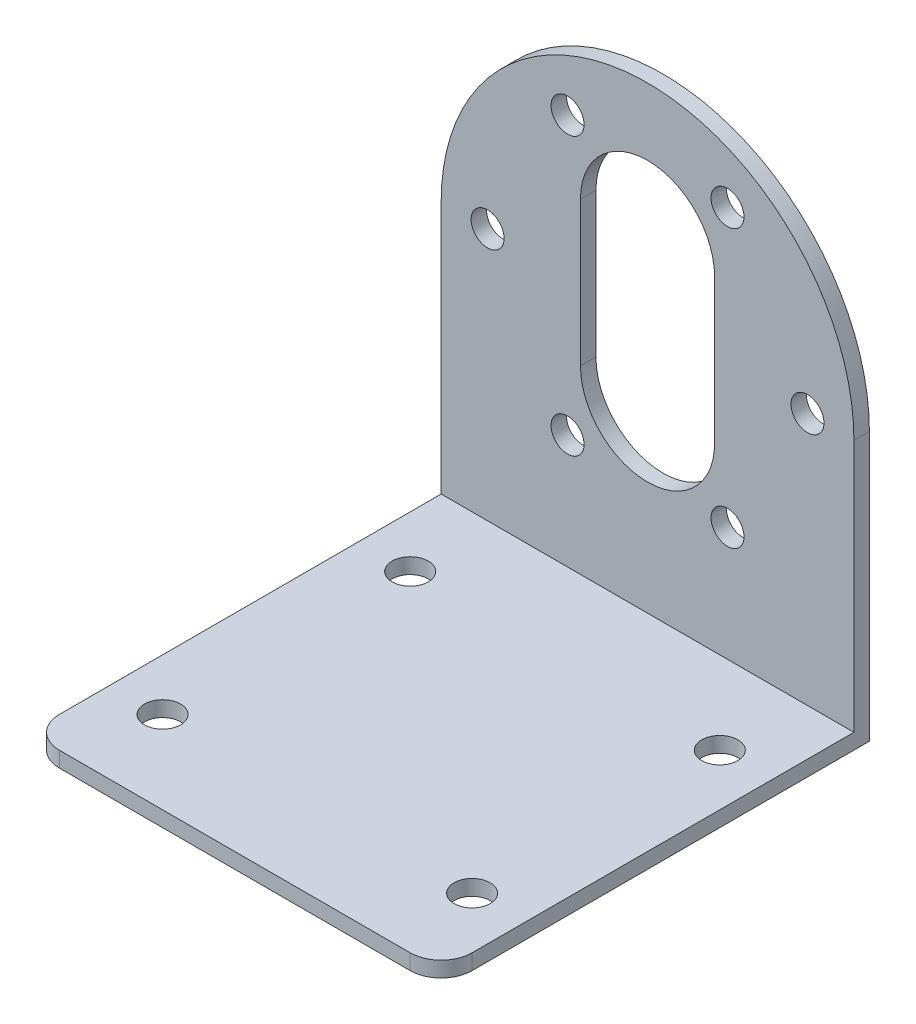
ISO-10303-21;
HEADER;
FILE_DESCRIPTION(('STEP AP214'),'2;1');
FILE_NAME('part.step','',(''),(''),'','','');
FILE_SCHEMA(('AUTOMOTIVE_DESIGN { 1 0 10303 214 1 1 1 1 }'));
ENDSEC;
DATA;
#1=APPLICATION_CONTEXT('core data for automotive mechanical design processes');
#2=APPLICATION_PROTOCOL_DEFINITION('international standard','automotive_design',2000,#1);
#3=PRODUCT_CONTEXT('',#1,'mechanical');
#4=PRODUCT('Part','Part','',(#3));
#5=PRODUCT_RELATED_PRODUCT_CATEGORY('part','',(#4));
#6=PRODUCT_DEFINITION_FORMATION('','',#4);
#7=PRODUCT_DEFINITION_CONTEXT('part definition',#1,'design');
#8=PRODUCT_DEFINITION('design','',#6,#7);
#9=PRODUCT_DEFINITION_SHAPE('','',#8);
#10=(LENGTH_UNIT() NAMED_UNIT(*) SI_UNIT(.MILLI.,.METRE.));
#11=(NAMED_UNIT(*) PLANE_ANGLE_UNIT() SI_UNIT($,.RADIAN.));
#12=(NAMED_UNIT(*) SI_UNIT($,.STERADIAN.) SOLID_ANGLE_UNIT());
#13=UNCERTAINTY_MEASURE_WITH_UNIT(LENGTH_MEASURE(1.E-05),#10,'distance_accuracy_value','');
#14=(GEOMETRIC_REPRESENTATION_CONTEXT(3) GLOBAL_UNCERTAINTY_ASSIGNED_CONTEXT((#13)) GLOBAL_UNIT_ASSIGNED_CONTEXT((#10,
#11,#12)) REPRESENTATION_CONTEXT('',''));
#15=CARTESIAN_POINT('',(0.,0.,0.));
#16=DIRECTION('',(0.,0.,1.));
#17=DIRECTION('',(1.,0.,0.));
#18=AXIS2_PLACEMENT_3D('',#15,#16,#17);
#19=CARTESIAN_POINT('',(-17.,1.5,37.));
#20=DIRECTION('',(0.,-1.,0.));
#21=DIRECTION('',(0.,0.,-1.));
#22=AXIS2_PLACEMENT_3D('',#19,#20,#21);
#23=PLANE('',#22);
#24=DIRECTION('',(0.,0.,1.));
#25=VECTOR('',#24,1.);
#26=CARTESIAN_POINT('',(-20.,1.5,0.));
#27=LINE('',#26,#25);
#28=CARTESIAN_POINT('',(-20.,1.5,0.));
#29=VERTEX_POINT('',#28);
#30=CARTESIAN_POINT('',(-20.,1.5,37.));
#31=VERTEX_POINT('',#30);
#32=EDGE_CURVE('E297',#29,#31,#27,.T.);
#33=ORIENTED_EDGE('',*,*,#32,.T.);
#34=CARTESIAN_POINT('',(-17.,1.5,37.));
#35=DIRECTION('',(0.,1.,0.));
#36=DIRECTION('',(0.,0.,-1.));
#37=AXIS2_PLACEMENT_3D('',#34,#35,#36);
#38=CIRCLE('',#37,3.);
#39=CARTESIAN_POINT('',(-17.,1.5,40.));
#40=VERTEX_POINT('',#39);
#41=EDGE_CURVE('E259',#31,#40,#38,.T.);
#42=ORIENTED_EDGE('',*,*,#41,.T.);
#43=DIRECTION('',(1.,0.,0.));
#44=VECTOR('',#43,1.);
#45=CARTESIAN_POINT('',(-17.,1.5,40.));
#46=LINE('',#45,#44);
#47=CARTESIAN_POINT('',(17.,1.5,40.));
#48=VERTEX_POINT('',#47);
#49=EDGE_CURVE('E267',#40,#48,#46,.T.);
#50=ORIENTED_EDGE('',*,*,#49,.T.);
#51=CARTESIAN_POINT('',(17.,1.5,37.));
#52=DIRECTION('',(0.,1.,0.));
#53=DIRECTION('',(0.,0.,1.));
#54=AXIS2_PLACEMENT_3D('',#51,#52,#53);
#55=CIRCLE('',#54,3.);
#56=CARTESIAN_POINT('',(20.,1.5,37.));
#57=VERTEX_POINT('',#56);
#58=EDGE_CURVE('E271',#48,#57,#55,.T.);
#59=ORIENTED_EDGE('',*,*,#58,.T.);
#60=DIRECTION('',(0.,0.,-1.));
#61=VECTOR('',#60,1.);
#62=CARTESIAN_POINT('',(20.,1.5,0.));
#63=LINE('',#62,#61);
#64=CARTESIAN_POINT('',(20.,1.5,0.));
#65=VERTEX_POINT('',#64);
#66=EDGE_CURVE('E279',#57,#65,#63,.T.);
#67=ORIENTED_EDGE('',*,*,#66,.T.);
#68=DIRECTION('',(-1.,0.,0.));
#69=VECTOR('',#68,1.);
#70=CARTESIAN_POINT('',(-20.,1.5,0.));
#71=LINE('',#70,#69);
#72=EDGE_CURVE('E281',#65,#29,#71,.T.);
#73=ORIENTED_EDGE('',*,*,#72,.T.);
#74=EDGE_LOOP('',(#33,#42,#50,#59,#67,#73));
#75=FACE_BOUND('',#74,.T.);
#76=CARTESIAN_POINT('',(-15.,1.5,7.99999999999999));
#77=DIRECTION('',(0.,1.,0.));
#78=DIRECTION('',(0.,0.,1.));
#79=AXIS2_PLACEMENT_3D('',#76,#77,#78);
#80=CIRCLE('',#79,1.75);
#81=CARTESIAN_POINT('',(-15.,1.5,9.74999999999999));
#82=VERTEX_POINT('',#81);
#83=EDGE_CURVE('E290',#82,#82,#80,.T.);
#84=ORIENTED_EDGE('',*,*,#83,.F.);
#85=EDGE_LOOP('',(#84));
#86=FACE_BOUND('',#85,.T.);
#87=CARTESIAN_POINT('',(15.,1.5,7.99999999999999));
#88=DIRECTION('',(0.,1.,0.));
#89=DIRECTION('',(0.,0.,1.));
#90=AXIS2_PLACEMENT_3D('',#87,#88,#89);
#91=CIRCLE('',#90,1.75);
#92=CARTESIAN_POINT('',(15.,1.5,9.74999999999999));
#93=VERTEX_POINT('',#92);
#94=EDGE_CURVE('E371',#93,#93,#91,.T.);
#95=ORIENTED_EDGE('',*,*,#94,.F.);
#96=EDGE_LOOP('',(#95));
#97=FACE_BOUND('',#96,.T.);
#98=CARTESIAN_POINT('',(-15.,1.5,32.));
#99=DIRECTION('',(0.,1.,0.));
#100=DIRECTION('',(0.,0.,1.));
#101=AXIS2_PLACEMENT_3D('',#98,#99,#100);
#102=CIRCLE('',#101,1.75);
#103=CARTESIAN_POINT('',(-15.,1.5,33.75));
#104=VERTEX_POINT('',#103);
#105=EDGE_CURVE('E365',#104,#104,#102,.T.);
#106=ORIENTED_EDGE('',*,*,#105,.F.);
#107=EDGE_LOOP('',(#106));
#108=FACE_BOUND('',#107,.T.);
#109=CARTESIAN_POINT('',(15.,1.5,32.));
#110=DIRECTION('',(0.,1.,0.));
#111=DIRECTION('',(0.,0.,1.));
#112=AXIS2_PLACEMENT_3D('',#109,#110,#111);
#113=CIRCLE('',#112,1.75);
#114=CARTESIAN_POINT('',(15.,1.5,33.75));
#115=VERTEX_POINT('',#114);
#116=EDGE_CURVE('E359',#115,#115,#113,.T.);
#117=ORIENTED_EDGE('',*,*,#116,.F.);
#118=EDGE_LOOP('',(#117));
#119=FACE_BOUND('',#118,.T.);
#120=ADVANCED_FACE('F208',(#75,#86,#97,#108,#119),#23,.F.);
#121=CARTESIAN_POINT('',(-17.,0.,37.));
#122=DIRECTION('',(0.,-1.,0.));
#123=DIRECTION('',(0.,0.,-1.));
#124=AXIS2_PLACEMENT_3D('',#121,#122,#123);
#125=PLANE('',#124);
#126=CARTESIAN_POINT('',(-15.,0.,32.));
#127=DIRECTION('',(0.,1.,0.));
#128=DIRECTION('',(0.,0.,1.));
#129=AXIS2_PLACEMENT_3D('',#126,#127,#128);
#130=CIRCLE('',#129,1.75);
#131=CARTESIAN_POINT('',(-15.,0.,33.75));
#132=VERTEX_POINT('',#131);
#133=EDGE_CURVE('E362',#132,#132,#130,.T.);
#134=ORIENTED_EDGE('',*,*,#133,.T.);
#135=EDGE_LOOP('',(#134));
#136=FACE_BOUND('',#135,.T.);
#137=CARTESIAN_POINT('',(-15.,0.,7.99999999999999));
#138=DIRECTION('',(0.,1.,0.));
#139=DIRECTION('',(0.,0.,1.));
#140=AXIS2_PLACEMENT_3D('',#137,#138,#139);
#141=CIRCLE('',#140,1.75);
#142=CARTESIAN_POINT('',(-15.,0.,9.74999999999999));
#143=VERTEX_POINT('',#142);
#144=EDGE_CURVE('E374',#143,#143,#141,.T.);
#145=ORIENTED_EDGE('',*,*,#144,.T.);
#146=EDGE_LOOP('',(#145));
#147=FACE_BOUND('',#146,.T.);
#148=DIRECTION('',(0.,0.,1.));
#149=VECTOR('',#148,1.);
#150=CARTESIAN_POINT('',(-20.,0.,0.));
#151=LINE('',#150,#149);
#152=CARTESIAN_POINT('',(-20.,0.,-1.5));
#153=VERTEX_POINT('',#152);
#154=CARTESIAN_POINT('',(-20.,0.,37.));
#155=VERTEX_POINT('',#154);
#156=EDGE_CURVE('E286',#153,#155,#151,.T.);
#157=ORIENTED_EDGE('',*,*,#156,.F.);
#158=DIRECTION('',(-1.,0.,0.));
#159=VECTOR('',#158,1.);
#160=CARTESIAN_POINT('',(20.,0.,-1.5));
#161=LINE('',#160,#159);
#162=CARTESIAN_POINT('',(20.,0.,-1.5));
#163=VERTEX_POINT('',#162);
#164=EDGE_CURVE('E306',#163,#153,#161,.T.);
#165=ORIENTED_EDGE('',*,*,#164,.F.);
#166=DIRECTION('',(0.,0.,-1.));
#167=VECTOR('',#166,1.);
#168=CARTESIAN_POINT('',(20.,0.,0.));
#169=LINE('',#168,#167);
#170=CARTESIAN_POINT('',(20.,0.,37.));
#171=VERTEX_POINT('',#170);
#172=EDGE_CURVE('E294',#171,#163,#169,.T.);
#173=ORIENTED_EDGE('',*,*,#172,.F.);
#174=CARTESIAN_POINT('',(17.,0.,37.));
#175=DIRECTION('',(0.,1.,0.));
#176=DIRECTION('',(0.,0.,1.));
#177=AXIS2_PLACEMENT_3D('',#174,#175,#176);
#178=CIRCLE('',#177,3.);
#179=CARTESIAN_POINT('',(17.,0.,40.));
#180=VERTEX_POINT('',#179);
#181=EDGE_CURVE('E251',#180,#171,#178,.T.);
#182=ORIENTED_EDGE('',*,*,#181,.F.);
#183=DIRECTION('',(1.,0.,0.));
#184=VECTOR('',#183,1.);
#185=CARTESIAN_POINT('',(-17.,0.,40.));
#186=LINE('',#185,#184);
#187=CARTESIAN_POINT('',(-17.,0.,40.));
#188=VERTEX_POINT('',#187);
#189=EDGE_CURVE('E244',#188,#180,#186,.T.);
#190=ORIENTED_EDGE('',*,*,#189,.F.);
#191=CARTESIAN_POINT('',(-17.,0.,37.));
#192=DIRECTION('',(0.,1.,0.));
#193=DIRECTION('',(0.,0.,-1.));
#194=AXIS2_PLACEMENT_3D('',#191,#192,#193);
#195=CIRCLE('',#194,3.);
#196=EDGE_CURVE('E289',#155,#188,#195,.T.);
#197=ORIENTED_EDGE('',*,*,#196,.F.);
#198=EDGE_LOOP('',(#157,#165,#173,#182,#190,#197));
#199=FACE_BOUND('',#198,.T.);
#200=CARTESIAN_POINT('',(15.,0.,7.99999999999999));
#201=DIRECTION('',(0.,1.,0.));
#202=DIRECTION('',(0.,0.,1.));
#203=AXIS2_PLACEMENT_3D('',#200,#201,#202);
#204=CIRCLE('',#203,1.75);
#205=CARTESIAN_POINT('',(15.,0.,9.74999999999999));
#206=VERTEX_POINT('',#205);
#207=EDGE_CURVE('E368',#206,#206,#204,.T.);
#208=ORIENTED_EDGE('',*,*,#207,.T.);
#209=EDGE_LOOP('',(#208));
#210=FACE_BOUND('',#209,.T.);
#211=CARTESIAN_POINT('',(15.,0.,32.));
#212=DIRECTION('',(0.,1.,0.));
#213=DIRECTION('',(0.,0.,1.));
#214=AXIS2_PLACEMENT_3D('',#211,#212,#213);
#215=CIRCLE('',#214,1.75);
#216=CARTESIAN_POINT('',(15.,0.,33.75));
#217=VERTEX_POINT('',#216);
#218=EDGE_CURVE('E357',#217,#217,#215,.T.);
#219=ORIENTED_EDGE('',*,*,#218,.T.);
#220=EDGE_LOOP('',(#219));
#221=FACE_BOUND('',#220,.T.);
#222=ADVANCED_FACE('F300',(#136,#147,#199,#210,#221),#125,.T.);
#223=CARTESIAN_POINT('',(-20.,1.5,0.));
#224=DIRECTION('',(1.,0.,0.));
#225=DIRECTION('',(0.,0.,-1.));
#226=AXIS2_PLACEMENT_3D('',#223,#224,#225);
#227=PLANE('',#226);
#228=ORIENTED_EDGE('',*,*,#156,.T.);
#229=DIRECTION('',(0.,-1.,0.));
#230=VECTOR('',#229,1.);
#231=CARTESIAN_POINT('',(-20.,1.5,37.));
#232=LINE('',#231,#230);
#233=EDGE_CURVE('E12',#31,#155,#232,.T.);
#234=ORIENTED_EDGE('',*,*,#233,.F.);
#235=ORIENTED_EDGE('',*,*,#32,.F.);
#236=DIRECTION('',(0.,1.,0.));
#237=VECTOR('',#236,1.);
#238=CARTESIAN_POINT('',(-20.,0.,0.));
#239=LINE('',#238,#237);
#240=CARTESIAN_POINT('',(-20.,26.,0.));
#241=VERTEX_POINT('',#240);
#242=EDGE_CURVE('E225',#29,#241,#239,.T.);
#243=ORIENTED_EDGE('',*,*,#242,.T.);
#244=DIRECTION('',(0.,0.,1.));
#245=VECTOR('',#244,1.);
#246=CARTESIAN_POINT('',(-20.,26.,-1.5));
#247=LINE('',#246,#245);
#248=CARTESIAN_POINT('',(-20.,26.,-1.5));
#249=VERTEX_POINT('',#248);
#250=EDGE_CURVE('E354',#249,#241,#247,.T.);
#251=ORIENTED_EDGE('',*,*,#250,.F.);
#252=DIRECTION('',(0.,1.,0.));
#253=VECTOR('',#252,1.);
#254=CARTESIAN_POINT('',(-20.,0.,-1.5));
#255=LINE('',#254,#253);
#256=EDGE_CURVE('E689',#153,#249,#255,.T.);
#257=ORIENTED_EDGE('',*,*,#256,.F.);
#258=EDGE_LOOP('',(#228,#234,#235,#243,#251,#257));
#259=FACE_BOUND('',#258,.T.);
#260=ADVANCED_FACE('F210',(#259),#227,.F.);
#261=CARTESIAN_POINT('',(-17.,1.5,37.));
#262=DIRECTION('',(0.,-1.,0.));
#263=DIRECTION('',(0.,0.,-1.));
#264=AXIS2_PLACEMENT_3D('',#261,#262,#263);
#265=CYLINDRICAL_SURFACE('',#264,3.);
#266=ORIENTED_EDGE('',*,*,#196,.T.);
#267=DIRECTION('',(0.,-1.,0.));
#268=VECTOR('',#267,1.);
#269=CARTESIAN_POINT('',(-17.,1.5,40.));
#270=LINE('',#269,#268);
#271=EDGE_CURVE('E217',#40,#188,#270,.T.);
#272=ORIENTED_EDGE('',*,*,#271,.F.);
#273=ORIENTED_EDGE('',*,*,#41,.F.);
#274=ORIENTED_EDGE('',*,*,#233,.T.);
#275=EDGE_LOOP('',(#266,#272,#273,#274));
#276=FACE_BOUND('',#275,.T.);
#277=ADVANCED_FACE('F384',(#276),#265,.T.);
#278=CARTESIAN_POINT('',(-17.,1.5,40.));
#279=DIRECTION('',(0.,0.,-1.));
#280=DIRECTION('',(-1.,0.,0.));
#281=AXIS2_PLACEMENT_3D('',#278,#279,#280);
#282=PLANE('',#281);
#283=ORIENTED_EDGE('',*,*,#189,.T.);
#284=DIRECTION('',(0.,-1.,0.));
#285=VECTOR('',#284,1.);
#286=CARTESIAN_POINT('',(17.,1.5,40.));
#287=LINE('',#286,#285);
#288=EDGE_CURVE('E273',#48,#180,#287,.T.);
#289=ORIENTED_EDGE('',*,*,#288,.F.);
#290=ORIENTED_EDGE('',*,*,#49,.F.);
#291=ORIENTED_EDGE('',*,*,#271,.T.);
#292=EDGE_LOOP('',(#283,#289,#290,#291));
#293=FACE_BOUND('',#292,.T.);
#294=ADVANCED_FACE('F274',(#293),#282,.F.);
#295=CARTESIAN_POINT('',(17.,1.5,37.));
#296=DIRECTION('',(0.,-1.,0.));
#297=DIRECTION('',(0.,0.,-1.));
#298=AXIS2_PLACEMENT_3D('',#295,#296,#297);
#299=CYLINDRICAL_SURFACE('',#298,3.);
#300=ORIENTED_EDGE('',*,*,#181,.T.);
#301=DIRECTION('',(0.,-1.,0.));
#302=VECTOR('',#301,1.);
#303=CARTESIAN_POINT('',(20.,1.5,37.));
#304=LINE('',#303,#302);
#305=EDGE_CURVE('E275',#57,#171,#304,.T.);
#306=ORIENTED_EDGE('',*,*,#305,.F.);
#307=ORIENTED_EDGE('',*,*,#58,.F.);
#308=ORIENTED_EDGE('',*,*,#288,.T.);
#309=EDGE_LOOP('',(#300,#306,#307,#308));
#310=FACE_BOUND('',#309,.T.);
#311=ADVANCED_FACE('F277',(#310),#299,.T.);
#312=CARTESIAN_POINT('',(20.,1.5,0.));
#313=DIRECTION('',(-1.,0.,0.));
#314=DIRECTION('',(0.,0.,1.));
#315=AXIS2_PLACEMENT_3D('',#312,#313,#314);
#316=PLANE('',#315);
#317=ORIENTED_EDGE('',*,*,#172,.T.);
#318=DIRECTION('',(0.,1.,0.));
#319=VECTOR('',#318,1.);
#320=CARTESIAN_POINT('',(20.,0.,-1.5));
#321=LINE('',#320,#319);
#322=CARTESIAN_POINT('',(20.,26.,-1.5));
#323=VERTEX_POINT('',#322);
#324=EDGE_CURVE('E313',#163,#323,#321,.T.);
#325=ORIENTED_EDGE('',*,*,#324,.T.);
#326=DIRECTION('',(0.,0.,1.));
#327=VECTOR('',#326,1.);
#328=CARTESIAN_POINT('',(20.,26.,-1.5));
#329=LINE('',#328,#327);
#330=CARTESIAN_POINT('',(20.,26.,0.));
#331=VERTEX_POINT('',#330);
#332=EDGE_CURVE('E341',#323,#331,#329,.T.);
#333=ORIENTED_EDGE('',*,*,#332,.T.);
#334=DIRECTION('',(0.,1.,0.));
#335=VECTOR('',#334,1.);
#336=CARTESIAN_POINT('',(20.,0.,0.));
#337=LINE('',#336,#335);
#338=EDGE_CURVE('E338',#65,#331,#337,.T.);
#339=ORIENTED_EDGE('',*,*,#338,.F.);
#340=ORIENTED_EDGE('',*,*,#66,.F.);
#341=ORIENTED_EDGE('',*,*,#305,.T.);
#342=EDGE_LOOP('',(#317,#325,#333,#339,#340,#341));
#343=FACE_BOUND('',#342,.T.);
#344=ADVANCED_FACE('F310',(#343),#316,.F.);
#345=CARTESIAN_POINT('',(-15.,1.5,7.99999999999999));
#346=DIRECTION('',(0.,-1.,0.));
#347=DIRECTION('',(0.,0.,-1.));
#348=AXIS2_PLACEMENT_3D('',#345,#346,#347);
#349=CYLINDRICAL_SURFACE('',#348,1.75);
#350=ORIENTED_EDGE('',*,*,#83,.T.);
#351=EDGE_LOOP('',(#350));
#352=FACE_BOUND('',#351,.T.);
#353=ORIENTED_EDGE('',*,*,#144,.F.);
#354=EDGE_LOOP('',(#353));
#355=FACE_BOUND('',#354,.T.);
#356=ADVANCED_FACE('F399',(#352,#355),#349,.F.);
#357=CARTESIAN_POINT('',(15.,1.5,7.99999999999999));
#358=DIRECTION('',(0.,-1.,0.));
#359=DIRECTION('',(0.,0.,-1.));
#360=AXIS2_PLACEMENT_3D('',#357,#358,#359);
#361=CYLINDRICAL_SURFACE('',#360,1.75);
#362=ORIENTED_EDGE('',*,*,#94,.T.);
#363=EDGE_LOOP('',(#362));
#364=FACE_BOUND('',#363,.T.);
#365=ORIENTED_EDGE('',*,*,#207,.F.);
#366=EDGE_LOOP('',(#365));
#367=FACE_BOUND('',#366,.T.);
#368=ADVANCED_FACE('F421',(#364,#367),#361,.F.);
#369=CARTESIAN_POINT('',(-15.,1.5,32.));
#370=DIRECTION('',(0.,-1.,0.));
#371=DIRECTION('',(0.,0.,-1.));
#372=AXIS2_PLACEMENT_3D('',#369,#370,#371);
#373=CYLINDRICAL_SURFACE('',#372,1.75);
#374=ORIENTED_EDGE('',*,*,#105,.T.);
#375=EDGE_LOOP('',(#374));
#376=FACE_BOUND('',#375,.T.);
#377=ORIENTED_EDGE('',*,*,#133,.F.);
#378=EDGE_LOOP('',(#377));
#379=FACE_BOUND('',#378,.T.);
#380=ADVANCED_FACE('F428',(#376,#379),#373,.F.);
#381=CARTESIAN_POINT('',(15.,1.5,32.));
#382=DIRECTION('',(0.,-1.,0.));
#383=DIRECTION('',(0.,0.,-1.));
#384=AXIS2_PLACEMENT_3D('',#381,#382,#383);
#385=CYLINDRICAL_SURFACE('',#384,1.75);
#386=ORIENTED_EDGE('',*,*,#116,.T.);
#387=EDGE_LOOP('',(#386));
#388=FACE_BOUND('',#387,.T.);
#389=ORIENTED_EDGE('',*,*,#218,.F.);
#390=EDGE_LOOP('',(#389));
#391=FACE_BOUND('',#390,.T.);
#392=ADVANCED_FACE('F435',(#388,#391),#385,.F.);
#393=CARTESIAN_POINT('',(0.,26.,0.));
#394=DIRECTION('',(0.,0.,1.));
#395=DIRECTION('',(1.,0.,0.));
#396=AXIS2_PLACEMENT_3D('',#393,#394,#395);
#397=PLANE('',#396);
#398=CARTESIAN_POINT('',(7.75000000000007,39.4233937586588,0.));
#399=DIRECTION('',(0.,0.,1.));
#400=DIRECTION('',(1.,0.,0.));
#401=AXIS2_PLACEMENT_3D('',#398,#399,#400);
#402=CIRCLE('',#401,1.6);
#403=CARTESIAN_POINT('',(9.35000000000007,39.4233937586588,0.));
#404=VERTEX_POINT('',#403);
#405=EDGE_CURVE('E348',#404,#404,#402,.T.);
#406=ORIENTED_EDGE('',*,*,#405,.F.);
#407=EDGE_LOOP('',(#406));
#408=FACE_BOUND('',#407,.T.);
#409=CARTESIAN_POINT('',(-7.74999999999996,39.4233937586588,0.));
#410=DIRECTION('',(0.,0.,1.));
#411=DIRECTION('',(1.,0.,0.));
#412=AXIS2_PLACEMENT_3D('',#409,#410,#411);
#413=CIRCLE('',#412,1.6);
#414=CARTESIAN_POINT('',(-6.14999999999997,39.4233937586588,0.));
#415=VERTEX_POINT('',#414);
#416=EDGE_CURVE('E676',#415,#415,#413,.T.);
#417=ORIENTED_EDGE('',*,*,#416,.F.);
#418=EDGE_LOOP('',(#417));
#419=FACE_BOUND('',#418,.T.);
#420=CARTESIAN_POINT('',(-15.5,26.,0.));
#421=DIRECTION('',(0.,0.,1.));
#422=DIRECTION('',(1.,0.,0.));
#423=AXIS2_PLACEMENT_3D('',#420,#421,#422);
#424=CIRCLE('',#423,1.6);
#425=CARTESIAN_POINT('',(-13.9,26.,0.));
#426=VERTEX_POINT('',#425);
#427=EDGE_CURVE('E665',#426,#426,#424,.T.);
#428=ORIENTED_EDGE('',*,*,#427,.F.);
#429=EDGE_LOOP('',(#428));
#430=FACE_BOUND('',#429,.T.);
#431=CARTESIAN_POINT('',(0.,33.,0.));
#432=DIRECTION('',(0.,0.,1.));
#433=DIRECTION('',(1.,0.,0.));
#434=AXIS2_PLACEMENT_3D('',#431,#432,#433);
#435=CIRCLE('',#434,6.5);
#436=CARTESIAN_POINT('',(6.5,33.,0.));
#437=VERTEX_POINT('',#436);
#438=CARTESIAN_POINT('',(-6.5,33.,0.));
#439=VERTEX_POINT('',#438);
#440=EDGE_CURVE('E638',#437,#439,#435,.T.);
#441=ORIENTED_EDGE('',*,*,#440,.F.);
#442=DIRECTION('',(0.,-1.,0.));
#443=VECTOR('',#442,1.);
#444=CARTESIAN_POINT('',(6.5,33.,0.));
#445=LINE('',#444,#443);
#446=CARTESIAN_POINT('',(6.5,19.,0.));
#447=VERTEX_POINT('',#446);
#448=EDGE_CURVE('E645',#437,#447,#445,.T.);
#449=ORIENTED_EDGE('',*,*,#448,.T.);
#450=CARTESIAN_POINT('',(0.,19.,0.));
#451=DIRECTION('',(0.,0.,1.));
#452=DIRECTION('',(1.,0.,0.));
#453=AXIS2_PLACEMENT_3D('',#450,#451,#452);
#454=CIRCLE('',#453,6.5);
#455=CARTESIAN_POINT('',(-6.5,19.,0.));
#456=VERTEX_POINT('',#455);
#457=EDGE_CURVE('E657',#456,#447,#454,.T.);
#458=ORIENTED_EDGE('',*,*,#457,.F.);
#459=DIRECTION('',(0.,-1.,0.));
#460=VECTOR('',#459,1.);
#461=CARTESIAN_POINT('',(-6.5,33.,0.));
#462=LINE('',#461,#460);
#463=EDGE_CURVE('E654',#439,#456,#462,.T.);
#464=ORIENTED_EDGE('',*,*,#463,.F.);
#465=EDGE_LOOP('',(#441,#449,#458,#464));
#466=FACE_BOUND('',#465,.T.);
#467=CARTESIAN_POINT('',(15.5,25.9999999999999,0.));
#468=DIRECTION('',(0.,0.,1.));
#469=DIRECTION('',(1.,0.,0.));
#470=AXIS2_PLACEMENT_3D('',#467,#468,#469);
#471=CIRCLE('',#470,1.6);
#472=CARTESIAN_POINT('',(17.1,25.9999999999999,0.));
#473=VERTEX_POINT('',#472);
#474=EDGE_CURVE('E632',#473,#473,#471,.T.);
#475=ORIENTED_EDGE('',*,*,#474,.F.);
#476=EDGE_LOOP('',(#475));
#477=FACE_BOUND('',#476,.T.);
#478=CARTESIAN_POINT('',(-7.75000000000016,12.5766062413413,0.));
#479=DIRECTION('',(0.,0.,1.));
#480=DIRECTION('',(1.,0.,0.));
#481=AXIS2_PLACEMENT_3D('',#478,#479,#480);
#482=CIRCLE('',#481,1.6);
#483=CARTESIAN_POINT('',(-6.15000000000015,12.5766062413413,0.));
#484=VERTEX_POINT('',#483);
#485=EDGE_CURVE('E626',#484,#484,#482,.T.);
#486=ORIENTED_EDGE('',*,*,#485,.F.);
#487=EDGE_LOOP('',(#486));
#488=FACE_BOUND('',#487,.T.);
#489=CARTESIAN_POINT('',(7.74999999999988,12.5766062413411,0.));
#490=DIRECTION('',(0.,0.,1.));
#491=DIRECTION('',(1.,0.,0.));
#492=AXIS2_PLACEMENT_3D('',#489,#490,#491);
#493=CIRCLE('',#492,1.6);
#494=CARTESIAN_POINT('',(9.34999999999988,12.5766062413411,0.));
#495=VERTEX_POINT('',#494);
#496=EDGE_CURVE('E623',#495,#495,#493,.T.);
#497=ORIENTED_EDGE('',*,*,#496,.F.);
#498=EDGE_LOOP('',(#497));
#499=FACE_BOUND('',#498,.T.);
#500=ORIENTED_EDGE('',*,*,#72,.F.);
#501=ORIENTED_EDGE('',*,*,#338,.T.);
#502=CARTESIAN_POINT('',(0.,26.,0.));
#503=DIRECTION('',(0.,0.,1.));
#504=DIRECTION('',(1.,0.,0.));
#505=AXIS2_PLACEMENT_3D('',#502,#503,#504);
#506=CIRCLE('',#505,20.);
#507=EDGE_CURVE('E343',#331,#241,#506,.T.);
#508=ORIENTED_EDGE('',*,*,#507,.T.);
#509=ORIENTED_EDGE('',*,*,#242,.F.);
#510=EDGE_LOOP('',(#500,#501,#508,#509));
#511=FACE_BOUND('',#510,.T.);
#512=ADVANCED_FACE('F337',(#408,#419,#430,#466,#477,#488,#499,#511),#397,.T.);
#513=CARTESIAN_POINT('',(0.,26.,-1.5));
#514=DIRECTION('',(0.,0.,1.));
#515=DIRECTION('',(1.,0.,0.));
#516=AXIS2_PLACEMENT_3D('',#513,#514,#515);
#517=CYLINDRICAL_SURFACE('',#516,20.);
#518=ORIENTED_EDGE('',*,*,#507,.F.);
#519=ORIENTED_EDGE('',*,*,#332,.F.);
#520=CARTESIAN_POINT('',(0.,26.,-1.5));
#521=DIRECTION('',(0.,0.,1.));
#522=DIRECTION('',(1.,0.,0.));
#523=AXIS2_PLACEMENT_3D('',#520,#521,#522);
#524=CIRCLE('',#523,20.);
#525=EDGE_CURVE('E687',#323,#249,#524,.T.);
#526=ORIENTED_EDGE('',*,*,#525,.T.);
#527=ORIENTED_EDGE('',*,*,#250,.T.);
#528=EDGE_LOOP('',(#518,#519,#526,#527));
#529=FACE_BOUND('',#528,.T.);
#530=ADVANCED_FACE('F449',(#529),#517,.T.);
#531=CARTESIAN_POINT('',(0.,26.,-1.5));
#532=DIRECTION('',(0.,0.,1.));
#533=DIRECTION('',(1.,0.,0.));
#534=AXIS2_PLACEMENT_3D('',#531,#532,#533);
#535=PLANE('',#534);
#536=CARTESIAN_POINT('',(7.74999999999988,12.5766062413411,-1.5));
#537=DIRECTION('',(0.,0.,1.));
#538=DIRECTION('',(1.,0.,0.));
#539=AXIS2_PLACEMENT_3D('',#536,#537,#538);
#540=CIRCLE('',#539,1.6);
#541=CARTESIAN_POINT('',(9.34999999999988,12.5766062413411,-1.5));
#542=VERTEX_POINT('',#541);
#543=EDGE_CURVE('E620',#542,#542,#540,.T.);
#544=ORIENTED_EDGE('',*,*,#543,.T.);
#545=EDGE_LOOP('',(#544));
#546=FACE_BOUND('',#545,.T.);
#547=CARTESIAN_POINT('',(-7.75000000000016,12.5766062413413,-1.5));
#548=DIRECTION('',(0.,0.,1.));
#549=DIRECTION('',(1.,0.,0.));
#550=AXIS2_PLACEMENT_3D('',#547,#548,#549);
#551=CIRCLE('',#550,1.6);
#552=CARTESIAN_POINT('',(-6.15000000000015,12.5766062413413,-1.5));
#553=VERTEX_POINT('',#552);
#554=EDGE_CURVE('E629',#553,#553,#551,.T.);
#555=ORIENTED_EDGE('',*,*,#554,.T.);
#556=EDGE_LOOP('',(#555));
#557=FACE_BOUND('',#556,.T.);
#558=CARTESIAN_POINT('',(15.5,25.9999999999999,-1.5));
#559=DIRECTION('',(0.,0.,1.));
#560=DIRECTION('',(1.,0.,0.));
#561=AXIS2_PLACEMENT_3D('',#558,#559,#560);
#562=CIRCLE('',#561,1.6);
#563=CARTESIAN_POINT('',(17.1,25.9999999999999,-1.5));
#564=VERTEX_POINT('',#563);
#565=EDGE_CURVE('E635',#564,#564,#562,.T.);
#566=ORIENTED_EDGE('',*,*,#565,.T.);
#567=EDGE_LOOP('',(#566));
#568=FACE_BOUND('',#567,.T.);
#569=DIRECTION('',(0.,-1.,0.));
#570=VECTOR('',#569,1.);
#571=CARTESIAN_POINT('',(6.5,33.,-1.5));
#572=LINE('',#571,#570);
#573=CARTESIAN_POINT('',(6.5,33.,-1.5));
#574=VERTEX_POINT('',#573);
#575=CARTESIAN_POINT('',(6.5,19.,-1.5));
#576=VERTEX_POINT('',#575);
#577=EDGE_CURVE('E649',#574,#576,#572,.T.);
#578=ORIENTED_EDGE('',*,*,#577,.F.);
#579=CARTESIAN_POINT('',(0.,33.,-1.5));
#580=DIRECTION('',(0.,0.,1.));
#581=DIRECTION('',(1.,0.,0.));
#582=AXIS2_PLACEMENT_3D('',#579,#580,#581);
#583=CIRCLE('',#582,6.5);
#584=CARTESIAN_POINT('',(-6.5,33.,-1.5));
#585=VERTEX_POINT('',#584);
#586=EDGE_CURVE('E641',#574,#585,#583,.T.);
#587=ORIENTED_EDGE('',*,*,#586,.T.);
#588=DIRECTION('',(0.,-1.,0.));
#589=VECTOR('',#588,1.);
#590=CARTESIAN_POINT('',(-6.5,33.,-1.5));
#591=LINE('',#590,#589);
#592=CARTESIAN_POINT('',(-6.5,19.,-1.5));
#593=VERTEX_POINT('',#592);
#594=EDGE_CURVE('E644',#585,#593,#591,.T.);
#595=ORIENTED_EDGE('',*,*,#594,.T.);
#596=CARTESIAN_POINT('',(0.,19.,-1.5));
#597=DIRECTION('',(0.,0.,1.));
#598=DIRECTION('',(1.,0.,0.));
#599=AXIS2_PLACEMENT_3D('',#596,#597,#598);
#600=CIRCLE('',#599,6.5);
#601=EDGE_CURVE('E334',#593,#576,#600,.T.);
#602=ORIENTED_EDGE('',*,*,#601,.T.);
#603=EDGE_LOOP('',(#578,#587,#595,#602));
#604=FACE_BOUND('',#603,.T.);
#605=CARTESIAN_POINT('',(-15.5,26.,-1.5));
#606=DIRECTION('',(0.,0.,1.));
#607=DIRECTION('',(1.,0.,0.));
#608=AXIS2_PLACEMENT_3D('',#605,#606,#607);
#609=CIRCLE('',#608,1.6);
#610=CARTESIAN_POINT('',(-13.9,26.,-1.5));
#611=VERTEX_POINT('',#610);
#612=EDGE_CURVE('E673',#611,#611,#609,.T.);
#613=ORIENTED_EDGE('',*,*,#612,.T.);
#614=EDGE_LOOP('',(#613));
#615=FACE_BOUND('',#614,.T.);
#616=CARTESIAN_POINT('',(-7.74999999999996,39.4233937586588,-1.5));
#617=DIRECTION('',(0.,0.,1.));
#618=DIRECTION('',(1.,0.,0.));
#619=AXIS2_PLACEMENT_3D('',#616,#617,#618);
#620=CIRCLE('',#619,1.6);
#621=CARTESIAN_POINT('',(-6.14999999999997,39.4233937586588,-1.5));
#622=VERTEX_POINT('',#621);
#623=EDGE_CURVE('E679',#622,#622,#620,.T.);
#624=ORIENTED_EDGE('',*,*,#623,.T.);
#625=EDGE_LOOP('',(#624));
#626=FACE_BOUND('',#625,.T.);
#627=CARTESIAN_POINT('',(7.75000000000007,39.4233937586588,-1.5));
#628=DIRECTION('',(0.,0.,1.));
#629=DIRECTION('',(1.,0.,0.));
#630=AXIS2_PLACEMENT_3D('',#627,#628,#629);
#631=CIRCLE('',#630,1.6);
#632=CARTESIAN_POINT('',(9.35000000000007,39.4233937586588,-1.5));
#633=VERTEX_POINT('',#632);
#634=EDGE_CURVE('E344',#633,#633,#631,.T.);
#635=ORIENTED_EDGE('',*,*,#634,.T.);
#636=EDGE_LOOP('',(#635));
#637=FACE_BOUND('',#636,.T.);
#638=ORIENTED_EDGE('',*,*,#324,.F.);
#639=ORIENTED_EDGE('',*,*,#164,.T.);
#640=ORIENTED_EDGE('',*,*,#256,.T.);
#641=ORIENTED_EDGE('',*,*,#525,.F.);
#642=EDGE_LOOP('',(#638,#639,#640,#641));
#643=FACE_BOUND('',#642,.T.);
#644=ADVANCED_FACE('F457',(#546,#557,#568,#604,#615,#626,#637,#643),#535,.F.);
#645=CARTESIAN_POINT('',(7.75000000000007,39.4233937586588,-1.5));
#646=DIRECTION('',(0.,0.,1.));
#647=DIRECTION('',(1.,0.,0.));
#648=AXIS2_PLACEMENT_3D('',#645,#646,#647);
#649=CYLINDRICAL_SURFACE('',#648,1.6);
#650=ORIENTED_EDGE('',*,*,#634,.F.);
#651=EDGE_LOOP('',(#650));
#652=FACE_BOUND('',#651,.T.);
#653=ORIENTED_EDGE('',*,*,#405,.T.);
#654=EDGE_LOOP('',(#653));
#655=FACE_BOUND('',#654,.T.);
#656=ADVANCED_FACE('F465',(#652,#655),#649,.F.);
#657=CARTESIAN_POINT('',(-7.74999999999996,39.4233937586588,-1.5));
#658=DIRECTION('',(0.,0.,1.));
#659=DIRECTION('',(1.,0.,0.));
#660=AXIS2_PLACEMENT_3D('',#657,#658,#659);
#661=CYLINDRICAL_SURFACE('',#660,1.6);
#662=ORIENTED_EDGE('',*,*,#623,.F.);
#663=EDGE_LOOP('',(#662));
#664=FACE_BOUND('',#663,.T.);
#665=ORIENTED_EDGE('',*,*,#416,.T.);
#666=EDGE_LOOP('',(#665));
#667=FACE_BOUND('',#666,.T.);
#668=ADVANCED_FACE('F473',(#664,#667),#661,.F.);
#669=CARTESIAN_POINT('',(-15.5,26.,-1.5));
#670=DIRECTION('',(0.,0.,1.));
#671=DIRECTION('',(1.,0.,0.));
#672=AXIS2_PLACEMENT_3D('',#669,#670,#671);
#673=CYLINDRICAL_SURFACE('',#672,1.6);
#674=ORIENTED_EDGE('',*,*,#612,.F.);
#675=EDGE_LOOP('',(#674));
#676=FACE_BOUND('',#675,.T.);
#677=ORIENTED_EDGE('',*,*,#427,.T.);
#678=EDGE_LOOP('',(#677));
#679=FACE_BOUND('',#678,.T.);
#680=ADVANCED_FACE('F481',(#676,#679),#673,.F.);
#681=CARTESIAN_POINT('',(0.,33.,-1.5));
#682=DIRECTION('',(0.,0.,1.));
#683=DIRECTION('',(1.,0.,0.));
#684=AXIS2_PLACEMENT_3D('',#681,#682,#683);
#685=CYLINDRICAL_SURFACE('',#684,6.5);
#686=ORIENTED_EDGE('',*,*,#440,.T.);
#687=DIRECTION('',(0.,0.,1.));
#688=VECTOR('',#687,1.);
#689=CARTESIAN_POINT('',(-6.5,33.,-1.5));
#690=LINE('',#689,#688);
#691=EDGE_CURVE('E652',#585,#439,#690,.T.);
#692=ORIENTED_EDGE('',*,*,#691,.F.);
#693=ORIENTED_EDGE('',*,*,#586,.F.);
#694=DIRECTION('',(0.,0.,1.));
#695=VECTOR('',#694,1.);
#696=CARTESIAN_POINT('',(6.5,33.,-1.5));
#697=LINE('',#696,#695);
#698=EDGE_CURVE('E662',#574,#437,#697,.T.);
#699=ORIENTED_EDGE('',*,*,#698,.T.);
#700=EDGE_LOOP('',(#686,#692,#693,#699));
#701=FACE_BOUND('',#700,.T.);
#702=ADVANCED_FACE('F489',(#701),#685,.F.);
#703=CARTESIAN_POINT('',(6.5,33.,-1.5));
#704=DIRECTION('',(-1.,0.,0.));
#705=DIRECTION('',(0.,-1.,0.));
#706=AXIS2_PLACEMENT_3D('',#703,#704,#705);
#707=PLANE('',#706);
#708=ORIENTED_EDGE('',*,*,#448,.F.);
#709=ORIENTED_EDGE('',*,*,#698,.F.);
#710=ORIENTED_EDGE('',*,*,#577,.T.);
#711=DIRECTION('',(0.,0.,1.));
#712=VECTOR('',#711,1.);
#713=CARTESIAN_POINT('',(6.5,19.,-1.5));
#714=LINE('',#713,#712);
#715=EDGE_CURVE('E666',#576,#447,#714,.T.);
#716=ORIENTED_EDGE('',*,*,#715,.T.);
#717=EDGE_LOOP('',(#708,#709,#710,#716));
#718=FACE_BOUND('',#717,.T.);
#719=ADVANCED_FACE('F497',(#718),#707,.T.);
#720=CARTESIAN_POINT('',(0.,19.,-1.5));
#721=DIRECTION('',(0.,0.,1.));
#722=DIRECTION('',(1.,0.,0.));
#723=AXIS2_PLACEMENT_3D('',#720,#721,#722);
#724=CYLINDRICAL_SURFACE('',#723,6.5);
#725=ORIENTED_EDGE('',*,*,#457,.T.);
#726=ORIENTED_EDGE('',*,*,#715,.F.);
#727=ORIENTED_EDGE('',*,*,#601,.F.);
#728=DIRECTION('',(0.,0.,1.));
#729=VECTOR('',#728,1.);
#730=CARTESIAN_POINT('',(-6.5,19.,-1.5));
#731=LINE('',#730,#729);
#732=EDGE_CURVE('E669',#593,#456,#731,.T.);
#733=ORIENTED_EDGE('',*,*,#732,.T.);
#734=EDGE_LOOP('',(#725,#726,#727,#733));
#735=FACE_BOUND('',#734,.T.);
#736=ADVANCED_FACE('F505',(#735),#724,.F.);
#737=CARTESIAN_POINT('',(-6.5,33.,-1.5));
#738=DIRECTION('',(-1.,0.,0.));
#739=DIRECTION('',(0.,-1.,0.));
#740=AXIS2_PLACEMENT_3D('',#737,#738,#739);
#741=PLANE('',#740);
#742=ORIENTED_EDGE('',*,*,#463,.T.);
#743=ORIENTED_EDGE('',*,*,#732,.F.);
#744=ORIENTED_EDGE('',*,*,#594,.F.);
#745=ORIENTED_EDGE('',*,*,#691,.T.);
#746=EDGE_LOOP('',(#742,#743,#744,#745));
#747=FACE_BOUND('',#746,.T.);
#748=ADVANCED_FACE('F513',(#747),#741,.F.);
#749=CARTESIAN_POINT('',(15.5,25.9999999999999,-1.5));
#750=DIRECTION('',(0.,0.,1.));
#751=DIRECTION('',(1.,0.,0.));
#752=AXIS2_PLACEMENT_3D('',#749,#750,#751);
#753=CYLINDRICAL_SURFACE('',#752,1.6);
#754=ORIENTED_EDGE('',*,*,#565,.F.);
#755=EDGE_LOOP('',(#754));
#756=FACE_BOUND('',#755,.T.);
#757=ORIENTED_EDGE('',*,*,#474,.T.);
#758=EDGE_LOOP('',(#757));
#759=FACE_BOUND('',#758,.T.);
#760=ADVANCED_FACE('F520',(#756,#759),#753,.F.);
#761=CARTESIAN_POINT('',(-7.75000000000016,12.5766062413413,-1.5));
#762=DIRECTION('',(0.,0.,1.));
#763=DIRECTION('',(1.,0.,0.));
#764=AXIS2_PLACEMENT_3D('',#761,#762,#763);
#765=CYLINDRICAL_SURFACE('',#764,1.6);
#766=ORIENTED_EDGE('',*,*,#554,.F.);
#767=EDGE_LOOP('',(#766));
#768=FACE_BOUND('',#767,.T.);
#769=ORIENTED_EDGE('',*,*,#485,.T.);
#770=EDGE_LOOP('',(#769));
#771=FACE_BOUND('',#770,.T.);
#772=ADVANCED_FACE('F528',(#768,#771),#765,.F.);
#773=CARTESIAN_POINT('',(7.74999999999988,12.5766062413411,-1.5));
#774=DIRECTION('',(0.,0.,1.));
#775=DIRECTION('',(1.,0.,0.));
#776=AXIS2_PLACEMENT_3D('',#773,#774,#775);
#777=CYLINDRICAL_SURFACE('',#776,1.6);
#778=ORIENTED_EDGE('',*,*,#543,.F.);
#779=EDGE_LOOP('',(#778));
#780=FACE_BOUND('',#779,.T.);
#781=ORIENTED_EDGE('',*,*,#496,.T.);
#782=EDGE_LOOP('',(#781));
#783=FACE_BOUND('',#782,.T.);
#784=ADVANCED_FACE('F536',(#780,#783),#777,.F.);
#785=CLOSED_SHELL('',(#120,#222,#260,#277,#294,#311,#344,#356,#368,#380,#392,#512,#530,#644,
#656,#668,#680,#702,#719,#736,#748,#760,#772,#784));
#786=MANIFOLD_SOLID_BREP('B2',#785);
#787=ADVANCED_BREP_SHAPE_REPRESENTATION('',(#18,#786),#14);
#788=SHAPE_DEFINITION_REPRESENTATION(#9,#787);
ENDSEC;
END-ISO-10303-21;
